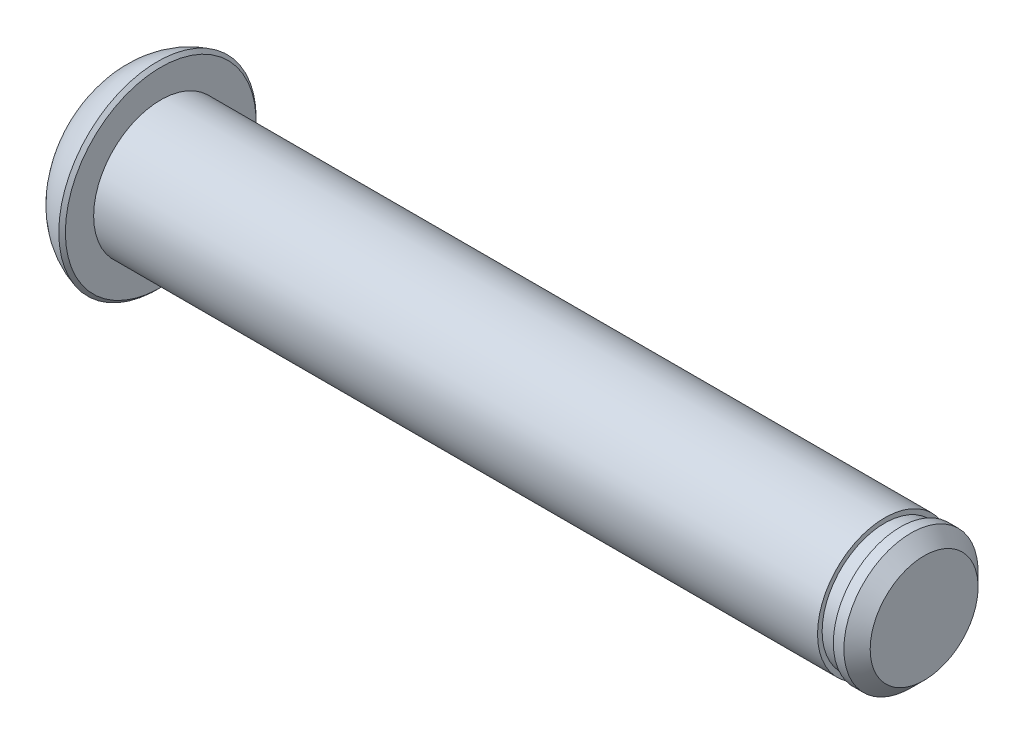
ISO-10303-21;
HEADER;
FILE_DESCRIPTION(('STEP AP214'),'2;1');
FILE_NAME('part.step','',(''),(''),'','','');
FILE_SCHEMA(('AUTOMOTIVE_DESIGN { 1 0 10303 214 1 1 1 1 }'));
ENDSEC;
DATA;
#1=APPLICATION_CONTEXT('core data for automotive mechanical design processes');
#2=APPLICATION_PROTOCOL_DEFINITION('international standard','automotive_design',2000,#1);
#3=PRODUCT_CONTEXT('',#1,'mechanical');
#4=PRODUCT('Part','Part','',(#3));
#5=PRODUCT_RELATED_PRODUCT_CATEGORY('part','',(#4));
#6=PRODUCT_DEFINITION_FORMATION('','',#4);
#7=PRODUCT_DEFINITION_CONTEXT('part definition',#1,'design');
#8=PRODUCT_DEFINITION('design','',#6,#7);
#9=PRODUCT_DEFINITION_SHAPE('','',#8);
#10=(LENGTH_UNIT() NAMED_UNIT(*) SI_UNIT(.MILLI.,.METRE.));
#11=(NAMED_UNIT(*) PLANE_ANGLE_UNIT() SI_UNIT($,.RADIAN.));
#12=(NAMED_UNIT(*) SI_UNIT($,.STERADIAN.) SOLID_ANGLE_UNIT());
#13=UNCERTAINTY_MEASURE_WITH_UNIT(LENGTH_MEASURE(1.E-05),#10,'distance_accuracy_value','');
#14=(GEOMETRIC_REPRESENTATION_CONTEXT(3) GLOBAL_UNCERTAINTY_ASSIGNED_CONTEXT((#13)) GLOBAL_UNIT_ASSIGNED_CONTEXT((#10,
#11,#12)) REPRESENTATION_CONTEXT('',''));
#15=CARTESIAN_POINT('',(0.,0.,0.));
#16=DIRECTION('',(0.,0.,1.));
#17=DIRECTION('',(1.,0.,0.));
#18=AXIS2_PLACEMENT_3D('',#15,#16,#17);
#19=CARTESIAN_POINT('',(0.,0.,0.));
#20=DIRECTION('',(-1.,0.,0.));
#21=DIRECTION('',(0.,0.,1.));
#22=AXIS2_PLACEMENT_3D('',#19,#20,#21);
#23=CYLINDRICAL_SURFACE('',#22,5.1);
#24=CARTESIAN_POINT('',(4.,0.,0.));
#25=DIRECTION('',(-1.,0.,0.));
#26=DIRECTION('',(0.,0.,1.));
#27=AXIS2_PLACEMENT_3D('',#24,#25,#26);
#28=CIRCLE('',#27,5.1);
#29=CARTESIAN_POINT('',(4.,0.,5.1));
#30=VERTEX_POINT('',#29);
#31=EDGE_CURVE('E67',#30,#30,#28,.T.);
#32=ORIENTED_EDGE('',*,*,#31,.F.);
#33=EDGE_LOOP('',(#32));
#34=FACE_BOUND('',#33,.T.);
#35=CARTESIAN_POINT('',(59.,0.,0.));
#36=DIRECTION('',(-1.,0.,0.));
#37=DIRECTION('',(0.,0.,1.));
#38=AXIS2_PLACEMENT_3D('',#35,#36,#37);
#39=CIRCLE('',#38,5.1);
#40=CARTESIAN_POINT('',(59.,0.,5.1));
#41=VERTEX_POINT('',#40);
#42=EDGE_CURVE('E70',#41,#41,#39,.T.);
#43=ORIENTED_EDGE('',*,*,#42,.T.);
#44=EDGE_LOOP('',(#43));
#45=FACE_BOUND('',#44,.T.);
#46=ADVANCED_FACE('F43',(#34,#45),#23,.T.);
#47=CARTESIAN_POINT('',(0.,0.,0.));
#48=DIRECTION('',(1.,0.,0.));
#49=DIRECTION('',(0.,0.,-1.));
#50=AXIS2_PLACEMENT_3D('',#47,#48,#49);
#51=PLANE('',#50);
#52=CARTESIAN_POINT('',(0.,0.,0.));
#53=DIRECTION('',(1.,0.,0.));
#54=DIRECTION('',(0.,0.,-1.));
#55=AXIS2_PLACEMENT_3D('',#52,#53,#54);
#56=CIRCLE('',#55,2.65877081724073);
#57=CARTESIAN_POINT('',(0.,0.,-2.65877081724073));
#58=VERTEX_POINT('',#57);
#59=EDGE_CURVE('E55',#58,#58,#56,.F.);
#60=ORIENTED_EDGE('',*,*,#59,.T.);
#61=EDGE_LOOP('',(#60));
#62=FACE_BOUND('',#61,.T.);
#63=ADVANCED_FACE('F100',(#62),#51,.F.);
#64=CARTESIAN_POINT('',(4.,7.5,0.));
#65=DIRECTION('',(-1.,0.,0.));
#66=DIRECTION('',(0.,0.,1.));
#67=AXIS2_PLACEMENT_3D('',#64,#65,#66);
#68=PLANE('',#67);
#69=CARTESIAN_POINT('',(4.,0.,0.));
#70=DIRECTION('',(-1.,0.,0.));
#71=DIRECTION('',(0.,0.,1.));
#72=AXIS2_PLACEMENT_3D('',#69,#70,#71);
#73=CIRCLE('',#72,7.24999999999999);
#74=CARTESIAN_POINT('',(4.,0.,7.24999999999999));
#75=VERTEX_POINT('',#74);
#76=EDGE_CURVE('E59',#75,#75,#73,.F.);
#77=ORIENTED_EDGE('',*,*,#76,.T.);
#78=EDGE_LOOP('',(#77));
#79=FACE_BOUND('',#78,.T.);
#80=ORIENTED_EDGE('',*,*,#31,.T.);
#81=EDGE_LOOP('',(#80));
#82=FACE_BOUND('',#81,.T.);
#83=ADVANCED_FACE('F107',(#79,#82),#68,.F.);
#84=CARTESIAN_POINT('',(3.74999999999999,0.,0.));
#85=DIRECTION('',(-1.,0.,0.));
#86=DIRECTION('',(0.,0.,1.));
#87=AXIS2_PLACEMENT_3D('',#84,#85,#86);
#88=CONICAL_SURFACE('',#87,7.5,0.785398163397445);
#89=ORIENTED_EDGE('',*,*,#76,.F.);
#90=EDGE_LOOP('',(#89));
#91=FACE_BOUND('',#90,.T.);
#92=CARTESIAN_POINT('',(3.74999999999999,0.,0.));
#93=DIRECTION('',(-1.,0.,0.));
#94=DIRECTION('',(0.,0.,1.));
#95=AXIS2_PLACEMENT_3D('',#92,#93,#94);
#96=CIRCLE('',#95,7.5);
#97=CARTESIAN_POINT('',(3.74999999999999,0.,7.5));
#98=VERTEX_POINT('',#97);
#99=EDGE_CURVE('E64',#98,#98,#96,.T.);
#100=ORIENTED_EDGE('',*,*,#99,.F.);
#101=EDGE_LOOP('',(#100));
#102=FACE_BOUND('',#101,.T.);
#103=ADVANCED_FACE('F116',(#91,#102),#88,.T.);
#104=CARTESIAN_POINT('',(59.,5.1,0.));
#105=DIRECTION('',(1.,0.,0.));
#106=DIRECTION('',(0.,0.,-1.));
#107=AXIS2_PLACEMENT_3D('',#104,#105,#106);
#108=PLANE('',#107);
#109=CARTESIAN_POINT('',(59.,0.,0.));
#110=DIRECTION('',(-1.,0.,0.));
#111=DIRECTION('',(0.,0.,1.));
#112=AXIS2_PLACEMENT_3D('',#109,#110,#111);
#113=CIRCLE('',#112,4.75);
#114=CARTESIAN_POINT('',(59.,0.,4.75));
#115=VERTEX_POINT('',#114);
#116=EDGE_CURVE('E73',#115,#115,#113,.T.);
#117=ORIENTED_EDGE('',*,*,#116,.T.);
#118=EDGE_LOOP('',(#117));
#119=FACE_BOUND('',#118,.T.);
#120=ORIENTED_EDGE('',*,*,#42,.F.);
#121=EDGE_LOOP('',(#120));
#122=FACE_BOUND('',#121,.T.);
#123=ADVANCED_FACE('F114',(#119,#122),#108,.T.);
#124=CARTESIAN_POINT('',(0.,0.,0.));
#125=DIRECTION('',(-1.,0.,0.));
#126=DIRECTION('',(0.,0.,1.));
#127=AXIS2_PLACEMENT_3D('',#124,#125,#126);
#128=CYLINDRICAL_SURFACE('',#127,4.75);
#129=CARTESIAN_POINT('',(60.2,0.,0.));
#130=DIRECTION('',(-1.,0.,0.));
#131=DIRECTION('',(0.,0.,1.));
#132=AXIS2_PLACEMENT_3D('',#129,#130,#131);
#133=CIRCLE('',#132,4.75);
#134=CARTESIAN_POINT('',(60.2,0.,4.75));
#135=VERTEX_POINT('',#134);
#136=EDGE_CURVE('E76',#135,#135,#133,.T.);
#137=ORIENTED_EDGE('',*,*,#136,.T.);
#138=EDGE_LOOP('',(#137));
#139=FACE_BOUND('',#138,.T.);
#140=ORIENTED_EDGE('',*,*,#116,.F.);
#141=EDGE_LOOP('',(#140));
#142=FACE_BOUND('',#141,.T.);
#143=ADVANCED_FACE('F115',(#139,#142),#128,.T.);
#144=CARTESIAN_POINT('',(60.2,4.75,0.));
#145=DIRECTION('',(-1.,0.,0.));
#146=DIRECTION('',(0.,0.,1.));
#147=AXIS2_PLACEMENT_3D('',#144,#145,#146);
#148=PLANE('',#147);
#149=CARTESIAN_POINT('',(60.2,0.,0.));
#150=DIRECTION('',(-1.,0.,0.));
#151=DIRECTION('',(0.,0.,1.));
#152=AXIS2_PLACEMENT_3D('',#149,#150,#151);
#153=CIRCLE('',#152,5.1);
#154=CARTESIAN_POINT('',(60.2,0.,5.1));
#155=VERTEX_POINT('',#154);
#156=EDGE_CURVE('E79',#155,#155,#153,.T.);
#157=ORIENTED_EDGE('',*,*,#156,.T.);
#158=EDGE_LOOP('',(#157));
#159=FACE_BOUND('',#158,.T.);
#160=ORIENTED_EDGE('',*,*,#136,.F.);
#161=EDGE_LOOP('',(#160));
#162=FACE_BOUND('',#161,.T.);
#163=ADVANCED_FACE('F83',(#159,#162),#148,.T.);
#164=CARTESIAN_POINT('',(62.,5.1,0.));
#165=DIRECTION('',(-1.,0.,0.));
#166=DIRECTION('',(0.,0.,1.));
#167=AXIS2_PLACEMENT_3D('',#164,#165,#166);
#168=PLANE('',#167);
#169=CARTESIAN_POINT('',(62.,0.,0.));
#170=DIRECTION('',(-1.,0.,0.));
#171=DIRECTION('',(0.,0.,1.));
#172=AXIS2_PLACEMENT_3D('',#169,#170,#171);
#173=CIRCLE('',#172,4.09999999999999);
#174=CARTESIAN_POINT('',(62.,0.,4.09999999999999));
#175=VERTEX_POINT('',#174);
#176=EDGE_CURVE('E10',#175,#175,#173,.F.);
#177=ORIENTED_EDGE('',*,*,#176,.T.);
#178=EDGE_LOOP('',(#177));
#179=FACE_BOUND('',#178,.T.);
#180=ADVANCED_FACE('F89',(#179),#168,.F.);
#181=CARTESIAN_POINT('',(61.,0.,0.));
#182=DIRECTION('',(-1.,0.,0.));
#183=DIRECTION('',(0.,0.,1.));
#184=AXIS2_PLACEMENT_3D('',#181,#182,#183);
#185=CIRCLE('',#184,5.1);
#186=CARTESIAN_POINT('',(61.,0.,5.1));
#187=VERTEX_POINT('',#186);
#188=EDGE_CURVE('E51',#187,#187,#185,.T.);
#189=ORIENTED_EDGE('',*,*,#188,.T.);
#190=EDGE_LOOP('',(#189));
#191=FACE_BOUND('',#190,.T.);
#192=ORIENTED_EDGE('',*,*,#156,.F.);
#193=EDGE_LOOP('',(#192));
#194=FACE_BOUND('',#193,.T.);
#195=ADVANCED_FACE('F86',(#191,#194),#23,.T.);
#196=CARTESIAN_POINT('',(5.,0.,0.));
#197=DIRECTION('',(-1.,0.,0.));
#198=DIRECTION('',(0.,0.,1.));
#199=AXIS2_PLACEMENT_3D('',#196,#197,#198);
#200=DEGENERATE_TOROIDAL_SURFACE('',#199,2.65877081724073,5.,.T.);
#201=ORIENTED_EDGE('',*,*,#99,.T.);
#202=EDGE_LOOP('',(#201));
#203=FACE_BOUND('',#202,.T.);
#204=ORIENTED_EDGE('',*,*,#59,.F.);
#205=EDGE_LOOP('',(#204));
#206=FACE_BOUND('',#205,.T.);
#207=ADVANCED_FACE('F88',(#203,#206),#200,.T.);
#208=CARTESIAN_POINT('',(61.,0.,0.));
#209=DIRECTION('',(-1.,0.,0.));
#210=DIRECTION('',(0.,0.,1.));
#211=AXIS2_PLACEMENT_3D('',#208,#209,#210);
#212=CONICAL_SURFACE('',#211,5.1,0.785398163397452);
#213=ORIENTED_EDGE('',*,*,#176,.F.);
#214=EDGE_LOOP('',(#213));
#215=FACE_BOUND('',#214,.T.);
#216=ORIENTED_EDGE('',*,*,#188,.F.);
#217=EDGE_LOOP('',(#216));
#218=FACE_BOUND('',#217,.T.);
#219=ADVANCED_FACE('F46',(#215,#218),#212,.T.);
#220=CLOSED_SHELL('',(#46,#63,#83,#103,#123,#143,#163,#180,#195,#207,#219));
#221=MANIFOLD_SOLID_BREP('B2',#220);
#222=ADVANCED_BREP_SHAPE_REPRESENTATION('',(#18,#221),#14);
#223=SHAPE_DEFINITION_REPRESENTATION(#9,#222);
ENDSEC;
END-ISO-10303-21;
